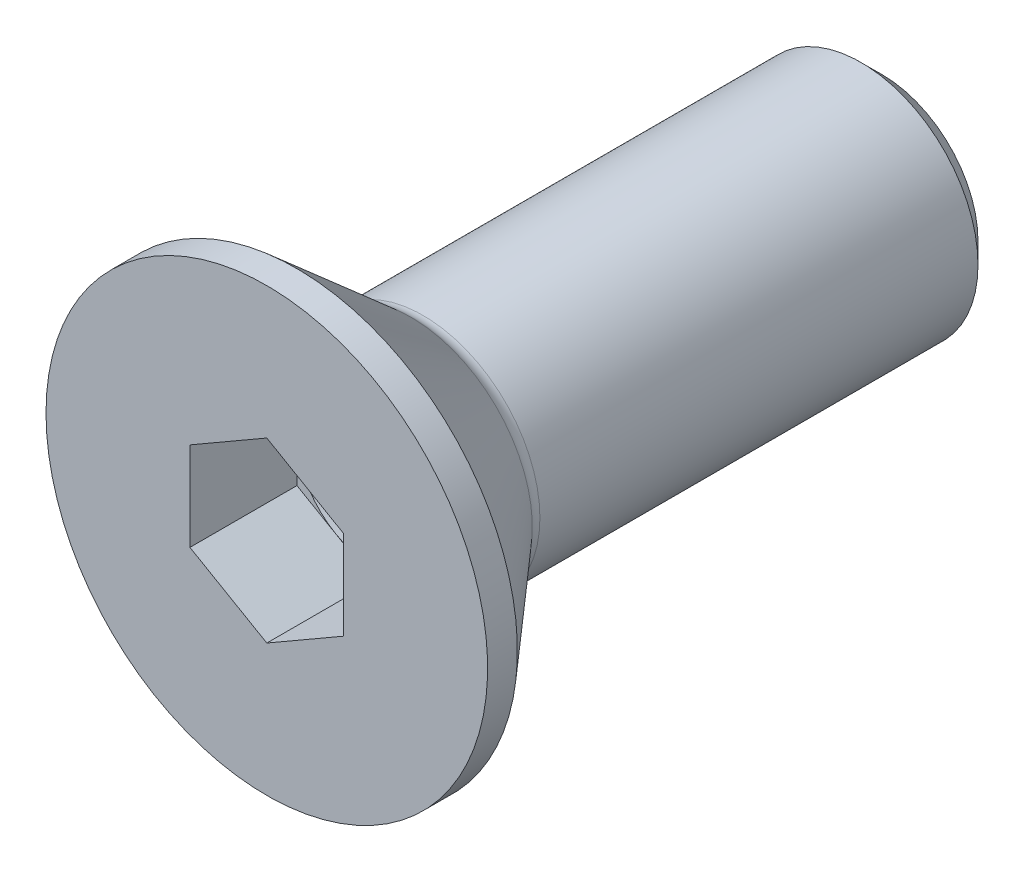
ISO-10303-21;
HEADER;
FILE_DESCRIPTION(('STEP AP214'),'2;1');
FILE_NAME('part.step','',(''),(''),'','','');
FILE_SCHEMA(('AUTOMOTIVE_DESIGN { 1 0 10303 214 1 1 1 1 }'));
ENDSEC;
DATA;
#1=APPLICATION_CONTEXT('core data for automotive mechanical design processes');
#2=APPLICATION_PROTOCOL_DEFINITION('international standard','automotive_design',2000,#1);
#3=PRODUCT_CONTEXT('',#1,'mechanical');
#4=PRODUCT('Part','Part','',(#3));
#5=PRODUCT_RELATED_PRODUCT_CATEGORY('part','',(#4));
#6=PRODUCT_DEFINITION_FORMATION('','',#4);
#7=PRODUCT_DEFINITION_CONTEXT('part definition',#1,'design');
#8=PRODUCT_DEFINITION('design','',#6,#7);
#9=PRODUCT_DEFINITION_SHAPE('','',#8);
#10=(LENGTH_UNIT() NAMED_UNIT(*) SI_UNIT(.MILLI.,.METRE.));
#11=(NAMED_UNIT(*) PLANE_ANGLE_UNIT() SI_UNIT($,.RADIAN.));
#12=(NAMED_UNIT(*) SI_UNIT($,.STERADIAN.) SOLID_ANGLE_UNIT());
#13=UNCERTAINTY_MEASURE_WITH_UNIT(LENGTH_MEASURE(1.E-05),#10,'distance_accuracy_value','');
#14=(GEOMETRIC_REPRESENTATION_CONTEXT(3) GLOBAL_UNCERTAINTY_ASSIGNED_CONTEXT((#13)) GLOBAL_UNIT_ASSIGNED_CONTEXT((#10,
#11,#12)) REPRESENTATION_CONTEXT('',''));
#15=CARTESIAN_POINT('',(0.,0.,0.));
#16=DIRECTION('',(0.,0.,1.));
#17=DIRECTION('',(1.,0.,0.));
#18=AXIS2_PLACEMENT_3D('',#15,#16,#17);
#19=CARTESIAN_POINT('',(0.,0.,-2.2098));
#20=DIRECTION('',(0.,0.,1.));
#21=DIRECTION('',(1.,0.,0.));
#22=AXIS2_PLACEMENT_3D('',#19,#20,#21);
#23=PLANE('',#22);
#24=CARTESIAN_POINT('',(0.,0.,-2.2098));
#25=DIRECTION('',(0.,0.,1.));
#26=DIRECTION('',(1.,0.,0.));
#27=AXIS2_PLACEMENT_3D('',#24,#25,#26);
#28=CIRCLE('',#27,1.5875);
#29=CARTESIAN_POINT('',(1.5875,0.,-2.2098));
#30=VERTEX_POINT('',#29);
#31=CARTESIAN_POINT('',(0.79375,1.3748153285078,-2.2098));
#32=VERTEX_POINT('',#31);
#33=EDGE_CURVE('E96',#30,#32,#28,.T.);
#34=ORIENTED_EDGE('',*,*,#33,.F.);
#35=DIRECTION('',(0.,-1.,0.));
#36=VECTOR('',#35,1.);
#37=CARTESIAN_POINT('',(1.5875,0.,-2.2098));
#38=LINE('',#37,#36);
#39=CARTESIAN_POINT('',(1.5875,0.916543552338531,-2.2098));
#40=VERTEX_POINT('',#39);
#41=EDGE_CURVE('E120',#40,#30,#38,.T.);
#42=ORIENTED_EDGE('',*,*,#41,.F.);
#43=DIRECTION('',(0.866025403784439,-0.5,0.));
#44=VECTOR('',#43,1.);
#45=CARTESIAN_POINT('',(1.82027223185862,0.782152441615088,-2.2098));
#46=LINE('',#45,#44);
#47=EDGE_CURVE('E118',#32,#40,#46,.T.);
#48=ORIENTED_EDGE('',*,*,#47,.F.);
#49=EDGE_LOOP('',(#34,#42,#48));
#50=FACE_BOUND('',#49,.T.);
#51=ADVANCED_FACE('F17',(#50),#23,.T.);
#52=CARTESIAN_POINT('',(-0.79375,1.3748153285078,-2.2098));
#53=VERTEX_POINT('',#52);
#54=EDGE_CURVE('E98',#32,#53,#28,.T.);
#55=ORIENTED_EDGE('',*,*,#54,.F.);
#56=CARTESIAN_POINT('',(0.,1.83308710467706,-2.2098));
#57=VERTEX_POINT('',#56);
#58=EDGE_CURVE('E113',#57,#32,#46,.T.);
#59=ORIENTED_EDGE('',*,*,#58,.F.);
#60=DIRECTION('',(0.866025403784438,0.5,0.));
#61=VECTOR('',#60,1.);
#62=CARTESIAN_POINT('',(-1.82027223185862,0.782152441615086,-2.2098));
#63=LINE('',#62,#61);
#64=EDGE_CURVE('E114',#53,#57,#63,.T.);
#65=ORIENTED_EDGE('',*,*,#64,.F.);
#66=EDGE_LOOP('',(#55,#59,#65));
#67=FACE_BOUND('',#66,.T.);
#68=ADVANCED_FACE('F111',(#67),#23,.T.);
#69=CARTESIAN_POINT('',(-1.5875,0.,-2.2098));
#70=VERTEX_POINT('',#69);
#71=EDGE_CURVE('E117',#53,#70,#28,.T.);
#72=ORIENTED_EDGE('',*,*,#71,.F.);
#73=CARTESIAN_POINT('',(-1.5875,0.916543552338531,-2.2098));
#74=VERTEX_POINT('',#73);
#75=EDGE_CURVE('E135',#74,#53,#63,.T.);
#76=ORIENTED_EDGE('',*,*,#75,.F.);
#77=DIRECTION('',(0.,1.,0.));
#78=VECTOR('',#77,1.);
#79=CARTESIAN_POINT('',(-1.5875,0.,-2.2098));
#80=LINE('',#79,#78);
#81=EDGE_CURVE('E139',#70,#74,#80,.T.);
#82=ORIENTED_EDGE('',*,*,#81,.F.);
#83=EDGE_LOOP('',(#72,#76,#82));
#84=FACE_BOUND('',#83,.T.);
#85=ADVANCED_FACE('F223',(#84),#23,.T.);
#86=CARTESIAN_POINT('',(-0.79375,-1.3748153285078,-2.2098));
#87=VERTEX_POINT('',#86);
#88=EDGE_CURVE('E248',#70,#87,#28,.T.);
#89=ORIENTED_EDGE('',*,*,#88,.F.);
#90=CARTESIAN_POINT('',(-1.5875,-0.91654355233853,-2.2098));
#91=VERTEX_POINT('',#90);
#92=EDGE_CURVE('E140',#91,#70,#80,.T.);
#93=ORIENTED_EDGE('',*,*,#92,.F.);
#94=DIRECTION('',(-0.866025403784439,0.5,0.));
#95=VECTOR('',#94,1.);
#96=CARTESIAN_POINT('',(0.232772231858619,-1.96747821540051,-2.2098));
#97=LINE('',#96,#95);
#98=EDGE_CURVE('E144',#87,#91,#97,.T.);
#99=ORIENTED_EDGE('',*,*,#98,.F.);
#100=EDGE_LOOP('',(#89,#93,#99));
#101=FACE_BOUND('',#100,.T.);
#102=ADVANCED_FACE('F235',(#101),#23,.T.);
#103=CARTESIAN_POINT('',(0.79375,-1.3748153285078,-2.2098));
#104=VERTEX_POINT('',#103);
#105=EDGE_CURVE('E33',#87,#104,#28,.T.);
#106=ORIENTED_EDGE('',*,*,#105,.F.);
#107=CARTESIAN_POINT('',(0.,-1.83308710467706,-2.2098));
#108=VERTEX_POINT('',#107);
#109=EDGE_CURVE('E145',#108,#87,#97,.T.);
#110=ORIENTED_EDGE('',*,*,#109,.F.);
#111=DIRECTION('',(-0.866025403784438,-0.5,0.));
#112=VECTOR('',#111,1.);
#113=CARTESIAN_POINT('',(1.82027223185862,-0.782152441615086,-2.2098));
#114=LINE('',#113,#112);
#115=EDGE_CURVE('E148',#104,#108,#114,.T.);
#116=ORIENTED_EDGE('',*,*,#115,.F.);
#117=EDGE_LOOP('',(#106,#110,#116));
#118=FACE_BOUND('',#117,.T.);
#119=ADVANCED_FACE('F228',(#118),#23,.T.);
#120=CARTESIAN_POINT('',(-2.27965,0.,0.));
#121=DIRECTION('',(0.,0.,-1.));
#122=DIRECTION('',(-1.,0.,0.));
#123=AXIS2_PLACEMENT_3D('',#120,#121,#122);
#124=PLANE('',#123);
#125=CARTESIAN_POINT('',(0.,0.,0.));
#126=DIRECTION('',(0.,0.,-1.));
#127=DIRECTION('',(-1.,0.,0.));
#128=AXIS2_PLACEMENT_3D('',#125,#126,#127);
#129=CIRCLE('',#128,4.5593);
#130=CARTESIAN_POINT('',(-4.5593,0.,0.));
#131=VERTEX_POINT('',#130);
#132=EDGE_CURVE('E205',#131,#131,#129,.T.);
#133=ORIENTED_EDGE('',*,*,#132,.F.);
#134=EDGE_LOOP('',(#133));
#135=FACE_BOUND('',#134,.T.);
#136=DIRECTION('',(0.866025403784439,-0.5,0.));
#137=VECTOR('',#136,1.);
#138=CARTESIAN_POINT('',(1.82027223185862,0.782152441615088,0.));
#139=LINE('',#138,#137);
#140=CARTESIAN_POINT('',(0.,1.83308710467706,0.));
#141=VERTEX_POINT('',#140);
#142=CARTESIAN_POINT('',(1.5875,0.916543552338531,0.));
#143=VERTEX_POINT('',#142);
#144=EDGE_CURVE('E106',#141,#143,#139,.T.);
#145=ORIENTED_EDGE('',*,*,#144,.T.);
#146=DIRECTION('',(0.,-1.,0.));
#147=VECTOR('',#146,1.);
#148=CARTESIAN_POINT('',(1.5875,0.,0.));
#149=LINE('',#148,#147);
#150=CARTESIAN_POINT('',(1.5875,-0.916543552338531,0.));
#151=VERTEX_POINT('',#150);
#152=EDGE_CURVE('E124',#143,#151,#149,.T.);
#153=ORIENTED_EDGE('',*,*,#152,.T.);
#154=DIRECTION('',(-0.866025403784438,-0.5,0.));
#155=VECTOR('',#154,1.);
#156=CARTESIAN_POINT('',(1.82027223185862,-0.782152441615086,0.));
#157=LINE('',#156,#155);
#158=CARTESIAN_POINT('',(0.,-1.83308710467706,0.));
#159=VERTEX_POINT('',#158);
#160=EDGE_CURVE('E41',#151,#159,#157,.T.);
#161=ORIENTED_EDGE('',*,*,#160,.T.);
#162=DIRECTION('',(-0.866025403784439,0.5,0.));
#163=VECTOR('',#162,1.);
#164=CARTESIAN_POINT('',(0.232772231858619,-1.96747821540051,0.));
#165=LINE('',#164,#163);
#166=CARTESIAN_POINT('',(-1.5875,-0.91654355233853,0.));
#167=VERTEX_POINT('',#166);
#168=EDGE_CURVE('E168',#159,#167,#165,.T.);
#169=ORIENTED_EDGE('',*,*,#168,.T.);
#170=DIRECTION('',(0.,1.,0.));
#171=VECTOR('',#170,1.);
#172=CARTESIAN_POINT('',(-1.5875,0.,0.));
#173=LINE('',#172,#171);
#174=CARTESIAN_POINT('',(-1.5875,0.916543552338531,0.));
#175=VERTEX_POINT('',#174);
#176=EDGE_CURVE('E164',#167,#175,#173,.T.);
#177=ORIENTED_EDGE('',*,*,#176,.T.);
#178=DIRECTION('',(0.866025403784438,0.5,0.));
#179=VECTOR('',#178,1.);
#180=CARTESIAN_POINT('',(-1.82027223185862,0.782152441615086,0.));
#181=LINE('',#180,#179);
#182=EDGE_CURVE('E160',#175,#141,#181,.T.);
#183=ORIENTED_EDGE('',*,*,#182,.T.);
#184=EDGE_LOOP('',(#145,#153,#161,#169,#177,#183));
#185=FACE_BOUND('',#184,.T.);
#186=ADVANCED_FACE('F234',(#135,#185),#124,.F.);
#187=CARTESIAN_POINT('',(0.,0.,3.39570524304279));
#188=DIRECTION('',(0.,0.,-1.));
#189=DIRECTION('',(-1.,0.,0.));
#190=AXIS2_PLACEMENT_3D('',#187,#188,#189);
#191=CYLINDRICAL_SURFACE('',#190,2.413);
#192=CARTESIAN_POINT('',(0.,0.,-12.27105761938));
#193=DIRECTION('',(0.,0.,1.));
#194=DIRECTION('',(1.,0.,0.));
#195=AXIS2_PLACEMENT_3D('',#192,#193,#194);
#196=CIRCLE('',#195,2.413);
#197=CARTESIAN_POINT('',(2.413,0.,-12.27105761938));
#198=VERTEX_POINT('',#197);
#199=EDGE_CURVE('E11',#198,#198,#196,.T.);
#200=ORIENTED_EDGE('',*,*,#199,.T.);
#201=EDGE_LOOP('',(#200));
#202=FACE_BOUND('',#201,.T.);
#203=CARTESIAN_POINT('',(0.,0.,-3.2258));
#204=DIRECTION('',(0.,0.,-1.));
#205=DIRECTION('',(-1.,0.,0.));
#206=AXIS2_PLACEMENT_3D('',#203,#204,#205);
#207=CIRCLE('',#206,2.413);
#208=CARTESIAN_POINT('',(-2.413,0.,-3.2258));
#209=VERTEX_POINT('',#208);
#210=EDGE_CURVE('E193',#209,#209,#207,.T.);
#211=ORIENTED_EDGE('',*,*,#210,.T.);
#212=EDGE_LOOP('',(#211));
#213=FACE_BOUND('',#212,.T.);
#214=ADVANCED_FACE('F240',(#202,#213),#191,.T.);
#215=CARTESIAN_POINT('',(-1.2065,0.,-12.7));
#216=DIRECTION('',(0.,0.,1.));
#217=DIRECTION('',(1.,0.,0.));
#218=AXIS2_PLACEMENT_3D('',#215,#216,#217);
#219=PLANE('',#218);
#220=CARTESIAN_POINT('',(0.,0.,-12.7));
#221=DIRECTION('',(0.,0.,1.));
#222=DIRECTION('',(1.,0.,0.));
#223=AXIS2_PLACEMENT_3D('',#220,#221,#222);
#224=CIRCLE('',#223,1.98405761938);
#225=CARTESIAN_POINT('',(1.98405761938,0.,-12.7));
#226=VERTEX_POINT('',#225);
#227=EDGE_CURVE('E26',#226,#226,#224,.F.);
#228=ORIENTED_EDGE('',*,*,#227,.T.);
#229=EDGE_LOOP('',(#228));
#230=FACE_BOUND('',#229,.T.);
#231=ADVANCED_FACE('F212',(#230),#219,.F.);
#232=CARTESIAN_POINT('',(0.,0.,3.39570524304279));
#233=DIRECTION('',(0.,0.,-1.));
#234=DIRECTION('',(-1.,0.,0.));
#235=AXIS2_PLACEMENT_3D('',#232,#233,#234);
#236=CYLINDRICAL_SURFACE('',#235,4.5593);
#237=CARTESIAN_POINT('',(0.,0.,-0.614314224697838));
#238=DIRECTION('',(0.,0.,-1.));
#239=DIRECTION('',(-1.,0.,0.));
#240=AXIS2_PLACEMENT_3D('',#237,#238,#239);
#241=CIRCLE('',#240,4.5593);
#242=CARTESIAN_POINT('',(-4.5593,0.,-0.614314224697838));
#243=VERTEX_POINT('',#242);
#244=EDGE_CURVE('E201',#243,#243,#241,.T.);
#245=ORIENTED_EDGE('',*,*,#244,.F.);
#246=EDGE_LOOP('',(#245));
#247=FACE_BOUND('',#246,.T.);
#248=ORIENTED_EDGE('',*,*,#132,.T.);
#249=EDGE_LOOP('',(#248));
#250=FACE_BOUND('',#249,.T.);
#251=ADVANCED_FACE('F293',(#247,#250),#236,.T.);
#252=CARTESIAN_POINT('',(0.,0.,-0.614314224697838));
#253=DIRECTION('',(0.,0.,1.));
#254=DIRECTION('',(1.,0.,0.));
#255=AXIS2_PLACEMENT_3D('',#252,#253,#254);
#256=CONICAL_SURFACE('',#255,4.5593,0.715584993317675);
#257=CARTESIAN_POINT('',(0.,0.,-2.97584150995462));
#258=DIRECTION('',(0.,0.,-1.));
#259=DIRECTION('',(-1.,0.,0.));
#260=AXIS2_PLACEMENT_3D('',#257,#258,#259);
#261=CIRCLE('',#260,2.50645564993513);
#262=CARTESIAN_POINT('',(-2.50645564993513,0.,-2.97584150995462));
#263=VERTEX_POINT('',#262);
#264=EDGE_CURVE('E197',#263,#263,#261,.T.);
#265=ORIENTED_EDGE('',*,*,#264,.F.);
#266=EDGE_LOOP('',(#265));
#267=FACE_BOUND('',#266,.T.);
#268=ORIENTED_EDGE('',*,*,#244,.T.);
#269=EDGE_LOOP('',(#268));
#270=FACE_BOUND('',#269,.T.);
#271=ADVANCED_FACE('F289',(#267,#270),#256,.T.);
#272=CARTESIAN_POINT('',(0.,0.,-3.2258));
#273=DIRECTION('',(0.,0.,-1.));
#274=DIRECTION('',(-1.,0.,0.));
#275=AXIS2_PLACEMENT_3D('',#272,#273,#274);
#276=TOROIDAL_SURFACE('',#275,2.794,0.381);
#277=ORIENTED_EDGE('',*,*,#264,.T.);
#278=EDGE_LOOP('',(#277));
#279=FACE_BOUND('',#278,.T.);
#280=ORIENTED_EDGE('',*,*,#210,.F.);
#281=EDGE_LOOP('',(#280));
#282=FACE_BOUND('',#281,.T.);
#283=ADVANCED_FACE('F283',(#279,#282),#276,.F.);
#284=CARTESIAN_POINT('',(1.82027223185862,0.782152441615088,-2.2098));
#285=DIRECTION('',(-0.5,-0.866025403784439,0.));
#286=DIRECTION('',(0.866025403784439,-0.5,0.));
#287=AXIS2_PLACEMENT_3D('',#284,#285,#286);
#288=PLANE('',#287);
#289=ORIENTED_EDGE('',*,*,#144,.F.);
#290=DIRECTION('',(0.,0.,1.));
#291=VECTOR('',#290,1.);
#292=CARTESIAN_POINT('',(0.,1.83308710467706,-2.2098));
#293=LINE('',#292,#291);
#294=EDGE_CURVE('E129',#57,#141,#293,.T.);
#295=ORIENTED_EDGE('',*,*,#294,.F.);
#296=ORIENTED_EDGE('',*,*,#58,.T.);
#297=ORIENTED_EDGE('',*,*,#47,.T.);
#298=DIRECTION('',(0.,0.,1.));
#299=VECTOR('',#298,1.);
#300=CARTESIAN_POINT('',(1.5875,0.916543552338531,-2.2098));
#301=LINE('',#300,#299);
#302=EDGE_CURVE('E156',#40,#143,#301,.T.);
#303=ORIENTED_EDGE('',*,*,#302,.T.);
#304=EDGE_LOOP('',(#289,#295,#296,#297,#303));
#305=FACE_BOUND('',#304,.T.);
#306=ADVANCED_FACE('F128',(#305),#288,.T.);
#307=CARTESIAN_POINT('',(-1.82027223185862,0.782152441615086,-2.2098));
#308=DIRECTION('',(0.5,-0.866025403784438,0.));
#309=DIRECTION('',(0.866025403784439,0.5,0.));
#310=AXIS2_PLACEMENT_3D('',#307,#308,#309);
#311=PLANE('',#310);
#312=ORIENTED_EDGE('',*,*,#182,.F.);
#313=DIRECTION('',(0.,0.,1.));
#314=VECTOR('',#313,1.);
#315=CARTESIAN_POINT('',(-1.5875,0.916543552338531,-2.2098));
#316=LINE('',#315,#314);
#317=EDGE_CURVE('E188',#74,#175,#316,.T.);
#318=ORIENTED_EDGE('',*,*,#317,.F.);
#319=ORIENTED_EDGE('',*,*,#75,.T.);
#320=ORIENTED_EDGE('',*,*,#64,.T.);
#321=ORIENTED_EDGE('',*,*,#294,.T.);
#322=EDGE_LOOP('',(#312,#318,#319,#320,#321));
#323=FACE_BOUND('',#322,.T.);
#324=ADVANCED_FACE('F276',(#323),#311,.T.);
#325=CARTESIAN_POINT('',(-1.5875,0.,-2.2098));
#326=DIRECTION('',(1.,0.,0.));
#327=DIRECTION('',(0.,0.,-1.));
#328=AXIS2_PLACEMENT_3D('',#325,#326,#327);
#329=PLANE('',#328);
#330=ORIENTED_EDGE('',*,*,#176,.F.);
#331=DIRECTION('',(0.,0.,1.));
#332=VECTOR('',#331,1.);
#333=CARTESIAN_POINT('',(-1.5875,-0.91654355233853,-2.2098));
#334=LINE('',#333,#332);
#335=EDGE_CURVE('E185',#91,#167,#334,.T.);
#336=ORIENTED_EDGE('',*,*,#335,.F.);
#337=ORIENTED_EDGE('',*,*,#92,.T.);
#338=ORIENTED_EDGE('',*,*,#81,.T.);
#339=ORIENTED_EDGE('',*,*,#317,.T.);
#340=EDGE_LOOP('',(#330,#336,#337,#338,#339));
#341=FACE_BOUND('',#340,.T.);
#342=ADVANCED_FACE('F270',(#341),#329,.T.);
#343=CARTESIAN_POINT('',(0.232772231858619,-1.96747821540051,-2.2098));
#344=DIRECTION('',(0.5,0.866025403784439,0.));
#345=DIRECTION('',(-0.866025403784439,0.5,0.));
#346=AXIS2_PLACEMENT_3D('',#343,#344,#345);
#347=PLANE('',#346);
#348=ORIENTED_EDGE('',*,*,#168,.F.);
#349=DIRECTION('',(0.,0.,1.));
#350=VECTOR('',#349,1.);
#351=CARTESIAN_POINT('',(0.,-1.83308710467706,-2.2098));
#352=LINE('',#351,#350);
#353=EDGE_CURVE('E182',#108,#159,#352,.T.);
#354=ORIENTED_EDGE('',*,*,#353,.F.);
#355=ORIENTED_EDGE('',*,*,#109,.T.);
#356=ORIENTED_EDGE('',*,*,#98,.T.);
#357=ORIENTED_EDGE('',*,*,#335,.T.);
#358=EDGE_LOOP('',(#348,#354,#355,#356,#357));
#359=FACE_BOUND('',#358,.T.);
#360=ADVANCED_FACE('F257',(#359),#347,.T.);
#361=CARTESIAN_POINT('',(1.82027223185862,-0.782152441615086,-2.2098));
#362=DIRECTION('',(-0.5,0.866025403784438,0.));
#363=DIRECTION('',(-0.866025403784438,-0.5,0.));
#364=AXIS2_PLACEMENT_3D('',#361,#362,#363);
#365=PLANE('',#364);
#366=ORIENTED_EDGE('',*,*,#160,.F.);
#367=DIRECTION('',(0.,0.,1.));
#368=VECTOR('',#367,1.);
#369=CARTESIAN_POINT('',(1.5875,-0.916543552338531,-2.2098));
#370=LINE('',#369,#368);
#371=CARTESIAN_POINT('',(1.5875,-0.916543552338531,-2.2098));
#372=VERTEX_POINT('',#371);
#373=EDGE_CURVE('E179',#372,#151,#370,.T.);
#374=ORIENTED_EDGE('',*,*,#373,.F.);
#375=EDGE_CURVE('E149',#372,#104,#114,.T.);
#376=ORIENTED_EDGE('',*,*,#375,.T.);
#377=ORIENTED_EDGE('',*,*,#115,.T.);
#378=ORIENTED_EDGE('',*,*,#353,.T.);
#379=EDGE_LOOP('',(#366,#374,#376,#377,#378));
#380=FACE_BOUND('',#379,.T.);
#381=ADVANCED_FACE('F231',(#380),#365,.T.);
#382=CARTESIAN_POINT('',(1.5875,0.,-2.2098));
#383=DIRECTION('',(-1.,0.,0.));
#384=DIRECTION('',(0.,0.,1.));
#385=AXIS2_PLACEMENT_3D('',#382,#383,#384);
#386=PLANE('',#385);
#387=ORIENTED_EDGE('',*,*,#152,.F.);
#388=ORIENTED_EDGE('',*,*,#302,.F.);
#389=ORIENTED_EDGE('',*,*,#41,.T.);
#390=EDGE_CURVE('E153',#30,#372,#38,.T.);
#391=ORIENTED_EDGE('',*,*,#390,.T.);
#392=ORIENTED_EDGE('',*,*,#373,.T.);
#393=EDGE_LOOP('',(#387,#388,#389,#391,#392));
#394=FACE_BOUND('',#393,.T.);
#395=ADVANCED_FACE('F226',(#394),#386,.T.);
#396=EDGE_CURVE('E100',#104,#30,#28,.T.);
#397=ORIENTED_EDGE('',*,*,#396,.F.);
#398=ORIENTED_EDGE('',*,*,#375,.F.);
#399=ORIENTED_EDGE('',*,*,#390,.F.);
#400=EDGE_LOOP('',(#397,#398,#399));
#401=FACE_BOUND('',#400,.T.);
#402=ADVANCED_FACE('F93',(#401),#23,.T.);
#403=CARTESIAN_POINT('',(0.,0.,-2.2098));
#404=DIRECTION('',(0.,0.,1.));
#405=DIRECTION('',(1.,0.,0.));
#406=AXIS2_PLACEMENT_3D('',#403,#404,#405);
#407=CONICAL_SURFACE('',#406,1.5875,1.22173047639603);
#408=CARTESIAN_POINT('',(0.,0.,-2.7876027468976));
#409=VERTEX_POINT('',#408);
#410=VERTEX_LOOP('',#409);
#411=FACE_BOUND('',#410,.T.);
#412=ORIENTED_EDGE('',*,*,#33,.T.);
#413=ORIENTED_EDGE('',*,*,#54,.T.);
#414=ORIENTED_EDGE('',*,*,#71,.T.);
#415=ORIENTED_EDGE('',*,*,#88,.T.);
#416=ORIENTED_EDGE('',*,*,#105,.T.);
#417=ORIENTED_EDGE('',*,*,#396,.T.);
#418=EDGE_LOOP('',(#412,#413,#414,#415,#416,#417));
#419=FACE_BOUND('',#418,.T.);
#420=ADVANCED_FACE('F91',(#411,#419),#407,.F.);
#421=CARTESIAN_POINT('',(0.,0.,-12.7));
#422=DIRECTION('',(0.,0.,1.));
#423=DIRECTION('',(1.,0.,0.));
#424=AXIS2_PLACEMENT_3D('',#421,#422,#423);
#425=CONICAL_SURFACE('',#424,1.98405761938,0.785398163397445);
#426=ORIENTED_EDGE('',*,*,#199,.F.);
#427=EDGE_LOOP('',(#426));
#428=FACE_BOUND('',#427,.T.);
#429=ORIENTED_EDGE('',*,*,#227,.F.);
#430=EDGE_LOOP('',(#429));
#431=FACE_BOUND('',#430,.T.);
#432=ADVANCED_FACE('F19',(#428,#431),#425,.T.);
#433=CLOSED_SHELL('',(#51,#68,#85,#102,#119,#186,#214,#231,#251,#271,#283,#306,#324,#342,#360,
#381,#395,#402,#420,#432));
#434=MANIFOLD_SOLID_BREP('B1',#433);
#435=ADVANCED_BREP_SHAPE_REPRESENTATION('',(#18,#434),#14);
#436=SHAPE_DEFINITION_REPRESENTATION(#9,#435);
ENDSEC;
END-ISO-10303-21;
